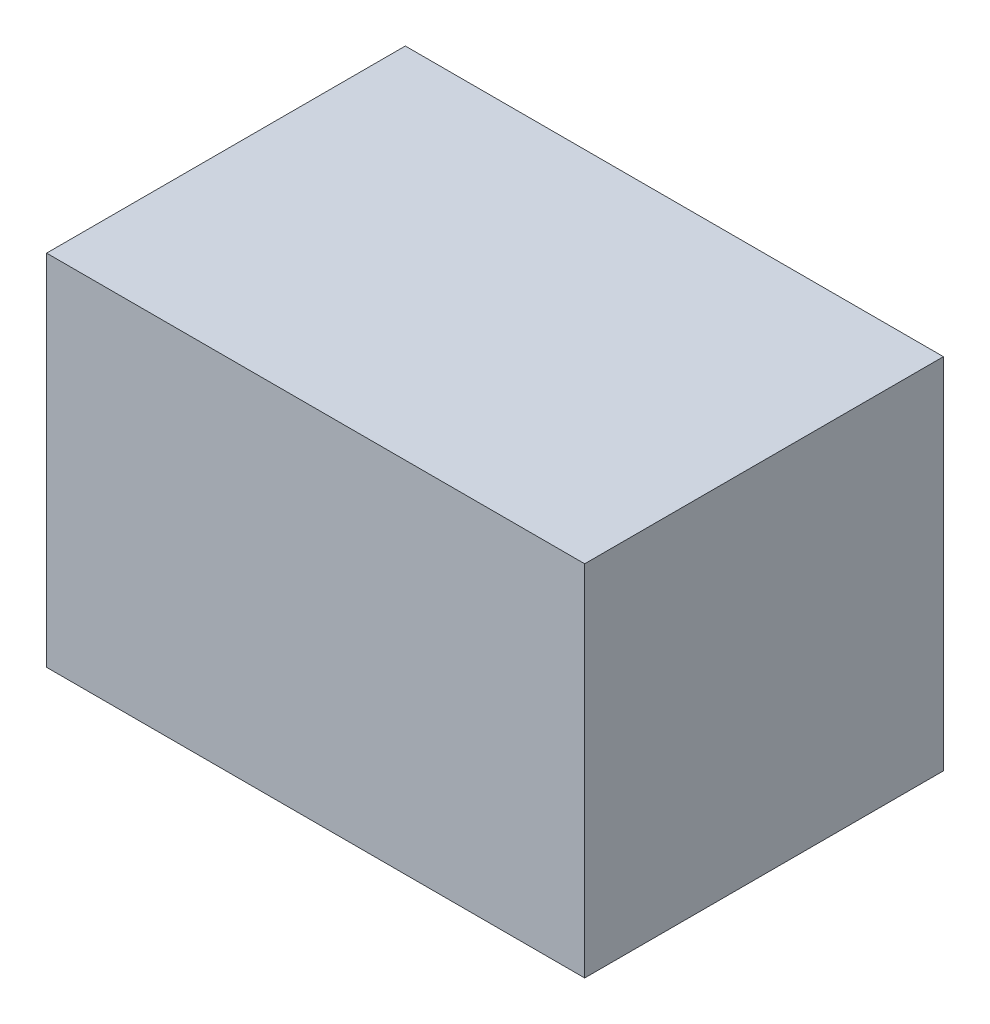
ISO-10303-21;
HEADER;
FILE_DESCRIPTION(('STEP AP214'),'2;1');
FILE_NAME('part.step','',(''),(''),'','','');
FILE_SCHEMA(('AUTOMOTIVE_DESIGN { 1 0 10303 214 1 1 1 1 }'));
ENDSEC;
DATA;
#1=APPLICATION_CONTEXT('core data for automotive mechanical design processes');
#2=APPLICATION_PROTOCOL_DEFINITION('international standard','automotive_design',2000,#1);
#3=PRODUCT_CONTEXT('',#1,'mechanical');
#4=PRODUCT('Part','Part','',(#3));
#5=PRODUCT_RELATED_PRODUCT_CATEGORY('part','',(#4));
#6=PRODUCT_DEFINITION_FORMATION('','',#4);
#7=PRODUCT_DEFINITION_CONTEXT('part definition',#1,'design');
#8=PRODUCT_DEFINITION('design','',#6,#7);
#9=PRODUCT_DEFINITION_SHAPE('','',#8);
#10=(LENGTH_UNIT() NAMED_UNIT(*) SI_UNIT(.MILLI.,.METRE.));
#11=(NAMED_UNIT(*) PLANE_ANGLE_UNIT() SI_UNIT($,.RADIAN.));
#12=(NAMED_UNIT(*) SI_UNIT($,.STERADIAN.) SOLID_ANGLE_UNIT());
#13=UNCERTAINTY_MEASURE_WITH_UNIT(LENGTH_MEASURE(1.E-05),#10,'distance_accuracy_value','');
#14=(GEOMETRIC_REPRESENTATION_CONTEXT(3) GLOBAL_UNCERTAINTY_ASSIGNED_CONTEXT((#13)) GLOBAL_UNIT_ASSIGNED_CONTEXT((#10,
#11,#12)) REPRESENTATION_CONTEXT('',''));
#15=CARTESIAN_POINT('',(0.,0.,0.));
#16=DIRECTION('',(0.,0.,1.));
#17=DIRECTION('',(1.,0.,0.));
#18=AXIS2_PLACEMENT_3D('',#15,#16,#17);
#19=CARTESIAN_POINT('',(57.15,0.,0.));
#20=DIRECTION('',(0.,0.,-1.));
#21=DIRECTION('',(-1.,0.,0.));
#22=AXIS2_PLACEMENT_3D('',#19,#20,#21);
#23=PLANE('',#22);
#24=DIRECTION('',(0.,-1.,0.));
#25=VECTOR('',#24,1.);
#26=CARTESIAN_POINT('',(0.,0.,0.));
#27=LINE('',#26,#25);
#28=CARTESIAN_POINT('',(0.,38.1,0.));
#29=VERTEX_POINT('',#28);
#30=CARTESIAN_POINT('',(0.,0.,0.));
#31=VERTEX_POINT('',#30);
#32=EDGE_CURVE('E113',#29,#31,#27,.T.);
#33=ORIENTED_EDGE('',*,*,#32,.T.);
#34=DIRECTION('',(-1.,0.,0.));
#35=VECTOR('',#34,1.);
#36=CARTESIAN_POINT('',(57.15,0.,0.));
#37=LINE('',#36,#35);
#38=CARTESIAN_POINT('',(57.15,0.,0.));
#39=VERTEX_POINT('',#38);
#40=EDGE_CURVE('E11',#39,#31,#37,.T.);
#41=ORIENTED_EDGE('',*,*,#40,.F.);
#42=DIRECTION('',(0.,-1.,0.));
#43=VECTOR('',#42,1.);
#44=CARTESIAN_POINT('',(57.15,0.,0.));
#45=LINE('',#44,#43);
#46=CARTESIAN_POINT('',(57.15,38.1,0.));
#47=VERTEX_POINT('',#46);
#48=EDGE_CURVE('E97',#47,#39,#45,.T.);
#49=ORIENTED_EDGE('',*,*,#48,.F.);
#50=DIRECTION('',(-1.,0.,0.));
#51=VECTOR('',#50,1.);
#52=CARTESIAN_POINT('',(57.15,38.1,0.));
#53=LINE('',#52,#51);
#54=EDGE_CURVE('E109',#47,#29,#53,.T.);
#55=ORIENTED_EDGE('',*,*,#54,.T.);
#56=EDGE_LOOP('',(#33,#41,#49,#55));
#57=FACE_BOUND('',#56,.T.);
#58=ADVANCED_FACE('F45',(#57),#23,.F.);
#59=CARTESIAN_POINT('',(57.15,0.,0.));
#60=DIRECTION('',(0.,1.,0.));
#61=DIRECTION('',(0.,0.,1.));
#62=AXIS2_PLACEMENT_3D('',#59,#60,#61);
#63=PLANE('',#62);
#64=DIRECTION('',(0.,0.,-1.));
#65=VECTOR('',#64,1.);
#66=CARTESIAN_POINT('',(0.,0.,0.));
#67=LINE('',#66,#65);
#68=CARTESIAN_POINT('',(0.,0.,-38.1));
#69=VERTEX_POINT('',#68);
#70=EDGE_CURVE('E102',#31,#69,#67,.T.);
#71=ORIENTED_EDGE('',*,*,#70,.T.);
#72=DIRECTION('',(-1.,0.,0.));
#73=VECTOR('',#72,1.);
#74=CARTESIAN_POINT('',(57.15,0.,-38.1));
#75=LINE('',#74,#73);
#76=CARTESIAN_POINT('',(57.15,0.,-38.1));
#77=VERTEX_POINT('',#76);
#78=EDGE_CURVE('E54',#77,#69,#75,.T.);
#79=ORIENTED_EDGE('',*,*,#78,.F.);
#80=DIRECTION('',(0.,0.,-1.));
#81=VECTOR('',#80,1.);
#82=CARTESIAN_POINT('',(57.15,0.,0.));
#83=LINE('',#82,#81);
#84=EDGE_CURVE('E92',#39,#77,#83,.T.);
#85=ORIENTED_EDGE('',*,*,#84,.F.);
#86=ORIENTED_EDGE('',*,*,#40,.T.);
#87=EDGE_LOOP('',(#71,#79,#85,#86));
#88=FACE_BOUND('',#87,.T.);
#89=ADVANCED_FACE('F101',(#88),#63,.F.);
#90=CARTESIAN_POINT('',(57.15,0.,-38.1));
#91=DIRECTION('',(0.,0.,1.));
#92=DIRECTION('',(1.,0.,0.));
#93=AXIS2_PLACEMENT_3D('',#90,#91,#92);
#94=PLANE('',#93);
#95=DIRECTION('',(0.,1.,0.));
#96=VECTOR('',#95,1.);
#97=CARTESIAN_POINT('',(0.,0.,-38.1));
#98=LINE('',#97,#96);
#99=CARTESIAN_POINT('',(0.,38.1,-38.1));
#100=VERTEX_POINT('',#99);
#101=EDGE_CURVE('E79',#69,#100,#98,.T.);
#102=ORIENTED_EDGE('',*,*,#101,.T.);
#103=DIRECTION('',(-1.,0.,0.));
#104=VECTOR('',#103,1.);
#105=CARTESIAN_POINT('',(57.15,38.1,-38.1));
#106=LINE('',#105,#104);
#107=CARTESIAN_POINT('',(57.15,38.1,-38.1));
#108=VERTEX_POINT('',#107);
#109=EDGE_CURVE('E104',#108,#100,#106,.T.);
#110=ORIENTED_EDGE('',*,*,#109,.F.);
#111=DIRECTION('',(0.,1.,0.));
#112=VECTOR('',#111,1.);
#113=CARTESIAN_POINT('',(57.15,0.,-38.1));
#114=LINE('',#113,#112);
#115=EDGE_CURVE('E95',#77,#108,#114,.T.);
#116=ORIENTED_EDGE('',*,*,#115,.F.);
#117=ORIENTED_EDGE('',*,*,#78,.T.);
#118=EDGE_LOOP('',(#102,#110,#116,#117));
#119=FACE_BOUND('',#118,.T.);
#120=ADVANCED_FACE('F105',(#119),#94,.F.);
#121=CARTESIAN_POINT('',(57.15,38.1,0.));
#122=DIRECTION('',(0.,-1.,0.));
#123=DIRECTION('',(0.,0.,-1.));
#124=AXIS2_PLACEMENT_3D('',#121,#122,#123);
#125=PLANE('',#124);
#126=DIRECTION('',(0.,0.,1.));
#127=VECTOR('',#126,1.);
#128=CARTESIAN_POINT('',(0.,38.1,0.));
#129=LINE('',#128,#127);
#130=EDGE_CURVE('E85',#100,#29,#129,.T.);
#131=ORIENTED_EDGE('',*,*,#130,.T.);
#132=ORIENTED_EDGE('',*,*,#54,.F.);
#133=DIRECTION('',(0.,0.,1.));
#134=VECTOR('',#133,1.);
#135=CARTESIAN_POINT('',(57.15,38.1,0.));
#136=LINE('',#135,#134);
#137=EDGE_CURVE('E62',#108,#47,#136,.T.);
#138=ORIENTED_EDGE('',*,*,#137,.F.);
#139=ORIENTED_EDGE('',*,*,#109,.T.);
#140=EDGE_LOOP('',(#131,#132,#138,#139));
#141=FACE_BOUND('',#140,.T.);
#142=ADVANCED_FACE('F126',(#141),#125,.F.);
#143=CARTESIAN_POINT('',(57.15,0.,0.));
#144=DIRECTION('',(-1.,0.,0.));
#145=DIRECTION('',(0.,0.,1.));
#146=AXIS2_PLACEMENT_3D('',#143,#144,#145);
#147=PLANE('',#146);
#148=ORIENTED_EDGE('',*,*,#48,.T.);
#149=ORIENTED_EDGE('',*,*,#84,.T.);
#150=ORIENTED_EDGE('',*,*,#115,.T.);
#151=ORIENTED_EDGE('',*,*,#137,.T.);
#152=EDGE_LOOP('',(#148,#149,#150,#151));
#153=FACE_BOUND('',#152,.T.);
#154=ADVANCED_FACE('F93',(#153),#147,.F.);
#155=CARTESIAN_POINT('',(0.,0.,0.));
#156=DIRECTION('',(-1.,0.,0.));
#157=DIRECTION('',(0.,0.,1.));
#158=AXIS2_PLACEMENT_3D('',#155,#156,#157);
#159=PLANE('',#158);
#160=ORIENTED_EDGE('',*,*,#32,.F.);
#161=ORIENTED_EDGE('',*,*,#130,.F.);
#162=ORIENTED_EDGE('',*,*,#101,.F.);
#163=ORIENTED_EDGE('',*,*,#70,.F.);
#164=EDGE_LOOP('',(#160,#161,#162,#163));
#165=FACE_BOUND('',#164,.T.);
#166=ADVANCED_FACE('F129',(#165),#159,.T.);
#167=CLOSED_SHELL('',(#58,#89,#120,#142,#154,#166));
#168=MANIFOLD_SOLID_BREP('B2',#167);
#169=ADVANCED_BREP_SHAPE_REPRESENTATION('',(#18,#168),#14);
#170=SHAPE_DEFINITION_REPRESENTATION(#9,#169);
ENDSEC;
END-ISO-10303-21;
